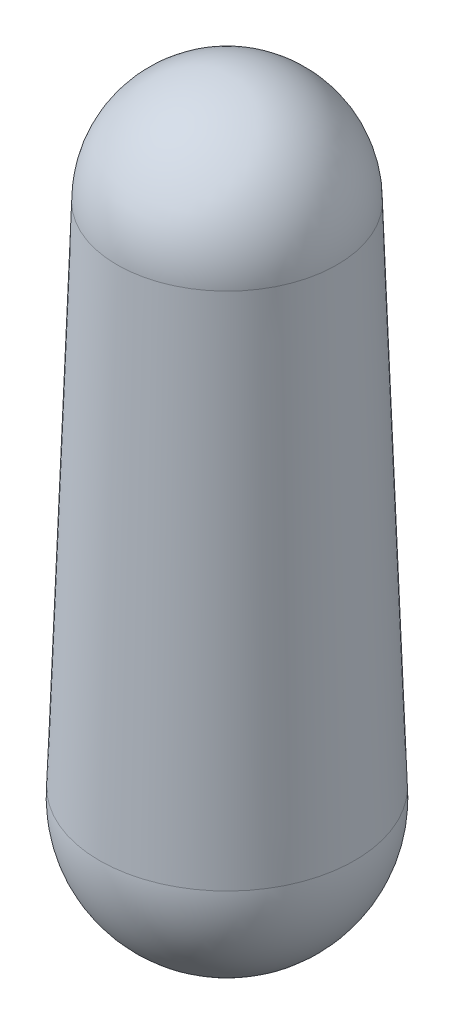
ISO-10303-21;
HEADER;
FILE_DESCRIPTION(('STEP AP214'),'2;1');
FILE_NAME('part.step','',(''),(''),'','','');
FILE_SCHEMA(('AUTOMOTIVE_DESIGN { 1 0 10303 214 1 1 1 1 }'));
ENDSEC;
DATA;
#1=APPLICATION_CONTEXT('core data for automotive mechanical design processes');
#2=APPLICATION_PROTOCOL_DEFINITION('international standard','automotive_design',2000,#1);
#3=PRODUCT_CONTEXT('',#1,'mechanical');
#4=PRODUCT('Part','Part','',(#3));
#5=PRODUCT_RELATED_PRODUCT_CATEGORY('part','',(#4));
#6=PRODUCT_DEFINITION_FORMATION('','',#4);
#7=PRODUCT_DEFINITION_CONTEXT('part definition',#1,'design');
#8=PRODUCT_DEFINITION('design','',#6,#7);
#9=PRODUCT_DEFINITION_SHAPE('','',#8);
#10=(LENGTH_UNIT() NAMED_UNIT(*) SI_UNIT(.MILLI.,.METRE.));
#11=(NAMED_UNIT(*) PLANE_ANGLE_UNIT() SI_UNIT($,.RADIAN.));
#12=(NAMED_UNIT(*) SI_UNIT($,.STERADIAN.) SOLID_ANGLE_UNIT());
#13=UNCERTAINTY_MEASURE_WITH_UNIT(LENGTH_MEASURE(1.E-05),#10,'distance_accuracy_value','');
#14=(GEOMETRIC_REPRESENTATION_CONTEXT(3) GLOBAL_UNCERTAINTY_ASSIGNED_CONTEXT((#13)) GLOBAL_UNIT_ASSIGNED_CONTEXT((#10,
#11,#12)) REPRESENTATION_CONTEXT('',''));
#15=CARTESIAN_POINT('',(0.,0.,0.));
#16=DIRECTION('',(0.,0.,1.));
#17=DIRECTION('',(1.,0.,0.));
#18=AXIS2_PLACEMENT_3D('',#15,#16,#17);
#19=CARTESIAN_POINT('',(0.,0.,0.));
#20=DIRECTION('',(0.,0.,-1.));
#21=DIRECTION('',(1.,0.,0.));
#22=AXIS2_PLACEMENT_3D('',#19,#20,#21);
#23=SPHERICAL_SURFACE('',#22,2.48);
#24=CARTESIAN_POINT('',(0.,0.,0.));
#25=DIRECTION('',(0.,-1.,0.));
#26=DIRECTION('',(0.,0.,-1.));
#27=AXIS2_PLACEMENT_3D('',#24,#25,#26);
#28=SPHERICAL_SURFACE('',#27,2.48);
#29=CARTESIAN_POINT('',(0.,0.1729960548847,0.));
#30=DIRECTION('',(0.,-1.,0.));
#31=DIRECTION('',(0.,0.,-1.));
#32=AXIS2_PLACEMENT_3D('',#29,#30,#31);
#33=CIRCLE('',#32,2.47395884464439);
#34=CARTESIAN_POINT('',(0.,0.1729960548847,-2.47395884464439));
#35=VERTEX_POINT('',#34);
#36=EDGE_CURVE('E10',#35,#35,#33,.F.);
#37=ORIENTED_EDGE('',*,*,#36,.F.);
#38=EDGE_LOOP('',(#37));
#39=FACE_BOUND('',#38,.T.);
#40=ADVANCED_FACE('F32',(#39),#28,.T.);
#41=CARTESIAN_POINT('',(0.,0.,0.));
#42=DIRECTION('',(0.,-1.,0.));
#43=DIRECTION('',(0.,0.,1.));
#44=AXIS2_PLACEMENT_3D('',#41,#42,#43);
#45=CONICAL_SURFACE('',#44,2.48,0.0349065850398866);
#46=CARTESIAN_POINT('',(0.,10.,0.));
#47=DIRECTION('',(0.,1.,0.));
#48=DIRECTION('',(0.,0.,1.));
#49=AXIS2_PLACEMENT_3D('',#46,#47,#48);
#50=CIRCLE('',#49,2.13079230508252);
#51=CARTESIAN_POINT('',(0.,10.,2.13079230508252));
#52=VERTEX_POINT('',#51);
#53=EDGE_CURVE('E38',#52,#52,#50,.T.);
#54=ORIENTED_EDGE('',*,*,#53,.F.);
#55=EDGE_LOOP('',(#54));
#56=FACE_BOUND('',#55,.T.);
#57=ORIENTED_EDGE('',*,*,#36,.T.);
#58=EDGE_LOOP('',(#57));
#59=FACE_BOUND('',#58,.T.);
#60=ADVANCED_FACE('F46',(#56,#59),#45,.T.);
#61=CARTESIAN_POINT('',(0.,10.,0.));
#62=DIRECTION('',(0.,0.,-1.));
#63=DIRECTION('',(1.,0.,0.));
#64=AXIS2_PLACEMENT_3D('',#61,#62,#63);
#65=SPHERICAL_SURFACE('',#64,2.13079230508252);
#66=CARTESIAN_POINT('',(0.,10.,0.));
#67=DIRECTION('',(0.,1.,0.));
#68=DIRECTION('',(0.,0.,1.));
#69=AXIS2_PLACEMENT_3D('',#66,#67,#68);
#70=SPHERICAL_SURFACE('',#69,2.13079230508252);
#71=ORIENTED_EDGE('',*,*,#53,.T.);
#72=EDGE_LOOP('',(#71));
#73=FACE_BOUND('',#72,.T.);
#74=ADVANCED_FACE('F44',(#73),#70,.T.);
#75=CLOSED_SHELL('',(#40,#60,#74));
#76=MANIFOLD_SOLID_BREP('B2',#75);
#77=ADVANCED_BREP_SHAPE_REPRESENTATION('',(#18,#76),#14);
#78=SHAPE_DEFINITION_REPRESENTATION(#9,#77);
ENDSEC;
END-ISO-10303-21;
